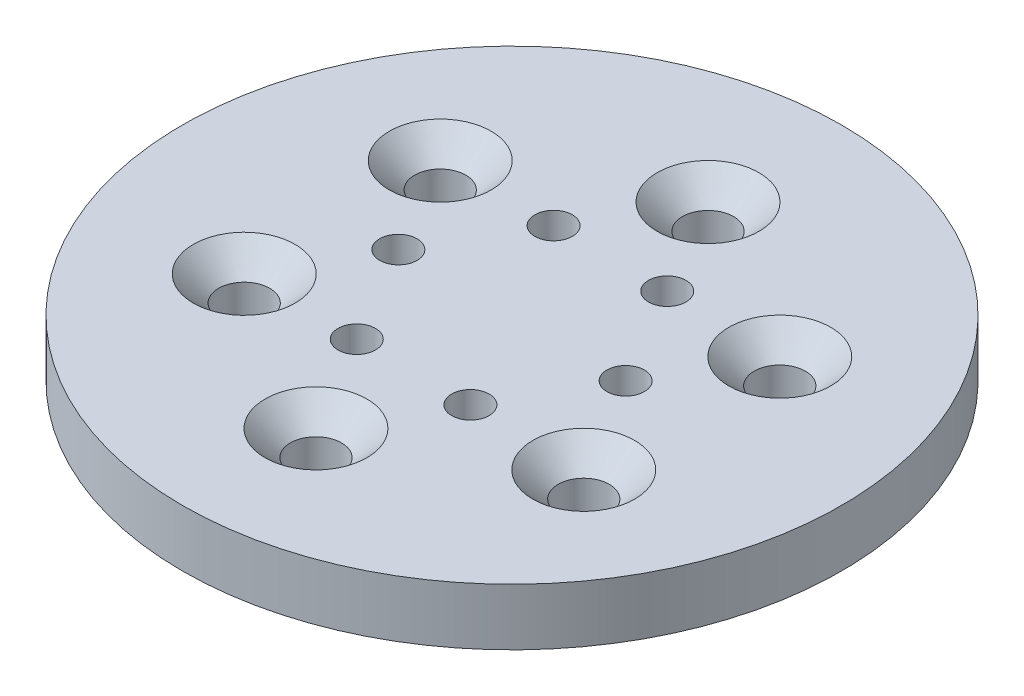
ISO-10303-21;
HEADER;
FILE_DESCRIPTION(('STEP AP214'),'2;1');
FILE_NAME('part.step','',(''),(''),'','','');
FILE_SCHEMA(('AUTOMOTIVE_DESIGN { 1 0 10303 214 1 1 1 1 }'));
ENDSEC;
DATA;
#1=APPLICATION_CONTEXT('core data for automotive mechanical design processes');
#2=APPLICATION_PROTOCOL_DEFINITION('international standard','automotive_design',2000,#1);
#3=PRODUCT_CONTEXT('',#1,'mechanical');
#4=PRODUCT('Part','Part','',(#3));
#5=PRODUCT_RELATED_PRODUCT_CATEGORY('part','',(#4));
#6=PRODUCT_DEFINITION_FORMATION('','',#4);
#7=PRODUCT_DEFINITION_CONTEXT('part definition',#1,'design');
#8=PRODUCT_DEFINITION('design','',#6,#7);
#9=PRODUCT_DEFINITION_SHAPE('','',#8);
#10=(LENGTH_UNIT() NAMED_UNIT(*) SI_UNIT(.MILLI.,.METRE.));
#11=(NAMED_UNIT(*) PLANE_ANGLE_UNIT() SI_UNIT($,.RADIAN.));
#12=(NAMED_UNIT(*) SI_UNIT($,.STERADIAN.) SOLID_ANGLE_UNIT());
#13=UNCERTAINTY_MEASURE_WITH_UNIT(LENGTH_MEASURE(1.E-05),#10,'distance_accuracy_value','');
#14=(GEOMETRIC_REPRESENTATION_CONTEXT(3) GLOBAL_UNCERTAINTY_ASSIGNED_CONTEXT((#13)) GLOBAL_UNIT_ASSIGNED_CONTEXT((#10,
#11,#12)) REPRESENTATION_CONTEXT('',''));
#15=CARTESIAN_POINT('',(0.,0.,0.));
#16=DIRECTION('',(0.,0.,1.));
#17=DIRECTION('',(1.,0.,0.));
#18=AXIS2_PLACEMENT_3D('',#15,#16,#17);
#19=CARTESIAN_POINT('',(0.,5.,0.));
#20=DIRECTION('',(0.,-1.,0.));
#21=DIRECTION('',(0.,0.,-1.));
#22=AXIS2_PLACEMENT_3D('',#19,#20,#21);
#23=CYLINDRICAL_SURFACE('',#22,29.);
#24=CARTESIAN_POINT('',(0.,5.,0.));
#25=DIRECTION('',(0.,1.,0.));
#26=DIRECTION('',(0.,0.,1.));
#27=AXIS2_PLACEMENT_3D('',#24,#25,#26);
#28=CIRCLE('',#27,29.);
#29=CARTESIAN_POINT('',(0.,5.,29.));
#30=VERTEX_POINT('',#29);
#31=EDGE_CURVE('E10',#30,#30,#28,.T.);
#32=ORIENTED_EDGE('',*,*,#31,.F.);
#33=EDGE_LOOP('',(#32));
#34=FACE_BOUND('',#33,.T.);
#35=CARTESIAN_POINT('',(0.,0.,0.));
#36=DIRECTION('',(0.,1.,0.));
#37=DIRECTION('',(0.,0.,1.));
#38=AXIS2_PLACEMENT_3D('',#35,#36,#37);
#39=CIRCLE('',#38,29.);
#40=CARTESIAN_POINT('',(0.,0.,29.));
#41=VERTEX_POINT('',#40);
#42=EDGE_CURVE('E50',#41,#41,#39,.T.);
#43=ORIENTED_EDGE('',*,*,#42,.T.);
#44=EDGE_LOOP('',(#43));
#45=FACE_BOUND('',#44,.T.);
#46=ADVANCED_FACE('F47',(#34,#45),#23,.T.);
#47=CARTESIAN_POINT('',(0.,5.,0.));
#48=DIRECTION('',(0.,1.,0.));
#49=DIRECTION('',(0.,0.,1.));
#50=AXIS2_PLACEMENT_3D('',#47,#48,#49);
#51=PLANE('',#50);
#52=CARTESIAN_POINT('',(-4.99999999999995,5.,-8.66025403784441));
#53=DIRECTION('',(0.,1.,0.));
#54=DIRECTION('',(0.,0.,1.));
#55=AXIS2_PLACEMENT_3D('',#52,#53,#54);
#56=CIRCLE('',#55,1.65);
#57=CARTESIAN_POINT('',(-4.99999999999995,5.,-7.01025403784441));
#58=VERTEX_POINT('',#57);
#59=EDGE_CURVE('E176',#58,#58,#56,.T.);
#60=ORIENTED_EDGE('',*,*,#59,.F.);
#61=EDGE_LOOP('',(#60));
#62=FACE_BOUND('',#61,.T.);
#63=CARTESIAN_POINT('',(5.00000000000006,5.,-8.66025403784492));
#64=DIRECTION('',(0.,1.,0.));
#65=DIRECTION('',(0.,0.,1.));
#66=AXIS2_PLACEMENT_3D('',#63,#64,#65);
#67=CIRCLE('',#66,1.65);
#68=CARTESIAN_POINT('',(5.00000000000006,5.,-7.01025403784492));
#69=VERTEX_POINT('',#68);
#70=EDGE_CURVE('E168',#69,#69,#67,.T.);
#71=ORIENTED_EDGE('',*,*,#70,.F.);
#72=EDGE_LOOP('',(#71));
#73=FACE_BOUND('',#72,.T.);
#74=CARTESIAN_POINT('',(10.0000000000005,5.,-7.86612467306541E-13));
#75=DIRECTION('',(0.,1.,0.));
#76=DIRECTION('',(0.,0.,1.));
#77=AXIS2_PLACEMENT_3D('',#74,#75,#76);
#78=CIRCLE('',#77,1.65);
#79=CARTESIAN_POINT('',(10.0000000000005,5.,1.64999999999921));
#80=VERTEX_POINT('',#79);
#81=EDGE_CURVE('E160',#80,#80,#78,.T.);
#82=ORIENTED_EDGE('',*,*,#81,.F.);
#83=EDGE_LOOP('',(#82));
#84=FACE_BOUND('',#83,.T.);
#85=CARTESIAN_POINT('',(5.00000000000093,5.,8.66025403784386));
#86=DIRECTION('',(0.,1.,0.));
#87=DIRECTION('',(0.,0.,1.));
#88=AXIS2_PLACEMENT_3D('',#85,#86,#87);
#89=CIRCLE('',#88,1.65);
#90=CARTESIAN_POINT('',(5.00000000000093,5.,10.3102540378439));
#91=VERTEX_POINT('',#90);
#92=EDGE_CURVE('E152',#91,#91,#89,.T.);
#93=ORIENTED_EDGE('',*,*,#92,.F.);
#94=EDGE_LOOP('',(#93));
#95=FACE_BOUND('',#94,.T.);
#96=CARTESIAN_POINT('',(-4.99999999999907,5.,8.66025403784437));
#97=DIRECTION('',(0.,1.,0.));
#98=DIRECTION('',(0.,0.,1.));
#99=AXIS2_PLACEMENT_3D('',#96,#97,#98);
#100=CIRCLE('',#99,1.65);
#101=CARTESIAN_POINT('',(-4.99999999999907,5.,10.3102540378444));
#102=VERTEX_POINT('',#101);
#103=EDGE_CURVE('E144',#102,#102,#100,.T.);
#104=ORIENTED_EDGE('',*,*,#103,.F.);
#105=EDGE_LOOP('',(#104));
#106=FACE_BOUND('',#105,.T.);
#107=CARTESIAN_POINT('',(-9.99999999999952,5.,2.2680718988484E-13));
#108=DIRECTION('',(0.,1.,0.));
#109=DIRECTION('',(0.,0.,1.));
#110=AXIS2_PLACEMENT_3D('',#107,#108,#109);
#111=CIRCLE('',#110,1.65);
#112=CARTESIAN_POINT('',(-9.99999999999952,5.,1.65000000000023));
#113=VERTEX_POINT('',#112);
#114=EDGE_CURVE('E136',#113,#113,#111,.T.);
#115=ORIENTED_EDGE('',*,*,#114,.F.);
#116=EDGE_LOOP('',(#115));
#117=FACE_BOUND('',#116,.T.);
#118=CARTESIAN_POINT('',(0.,5.,-17.25));
#119=DIRECTION('',(0.,1.,0.));
#120=DIRECTION('',(0.,0.,1.));
#121=AXIS2_PLACEMENT_3D('',#118,#119,#120);
#122=CIRCLE('',#121,4.48);
#123=CARTESIAN_POINT('',(0.,5.,-12.77));
#124=VERTEX_POINT('',#123);
#125=EDGE_CURVE('E128',#124,#124,#122,.T.);
#126=ORIENTED_EDGE('',*,*,#125,.F.);
#127=EDGE_LOOP('',(#126));
#128=FACE_BOUND('',#127,.T.);
#129=CARTESIAN_POINT('',(14.9389382152816,5.,-8.62499999999997));
#130=DIRECTION('',(0.,1.,0.));
#131=DIRECTION('',(0.,0.,1.));
#132=AXIS2_PLACEMENT_3D('',#129,#130,#131);
#133=CIRCLE('',#132,4.48);
#134=CARTESIAN_POINT('',(14.9389382152816,5.,-4.14499999999997));
#135=VERTEX_POINT('',#134);
#136=EDGE_CURVE('E116',#135,#135,#133,.T.);
#137=ORIENTED_EDGE('',*,*,#136,.F.);
#138=EDGE_LOOP('',(#137));
#139=FACE_BOUND('',#138,.T.);
#140=CARTESIAN_POINT('',(14.9389382152815,5.,8.62500000000007));
#141=DIRECTION('',(0.,1.,0.));
#142=DIRECTION('',(0.,0.,1.));
#143=AXIS2_PLACEMENT_3D('',#140,#141,#142);
#144=CIRCLE('',#143,4.48);
#145=CARTESIAN_POINT('',(14.9389382152815,5.,13.1050000000001));
#146=VERTEX_POINT('',#145);
#147=EDGE_CURVE('E104',#146,#146,#144,.T.);
#148=ORIENTED_EDGE('',*,*,#147,.F.);
#149=EDGE_LOOP('',(#148));
#150=FACE_BOUND('',#149,.T.);
#151=CARTESIAN_POINT('',(-1.20456106190088E-13,5.,17.25));
#152=DIRECTION('',(0.,1.,0.));
#153=DIRECTION('',(0.,0.,1.));
#154=AXIS2_PLACEMENT_3D('',#151,#152,#153);
#155=CIRCLE('',#154,4.48);
#156=CARTESIAN_POINT('',(-1.20456106190088E-13,5.,21.73));
#157=VERTEX_POINT('',#156);
#158=EDGE_CURVE('E92',#157,#157,#155,.T.);
#159=ORIENTED_EDGE('',*,*,#158,.F.);
#160=EDGE_LOOP('',(#159));
#161=FACE_BOUND('',#160,.T.);
#162=CARTESIAN_POINT('',(-14.9389382152816,5.,8.62499999999986));
#163=DIRECTION('',(0.,1.,0.));
#164=DIRECTION('',(0.,0.,1.));
#165=AXIS2_PLACEMENT_3D('',#162,#163,#164);
#166=CIRCLE('',#165,4.48);
#167=CARTESIAN_POINT('',(-14.9389382152816,5.,13.1049999999999));
#168=VERTEX_POINT('',#167);
#169=EDGE_CURVE('E80',#168,#168,#166,.T.);
#170=ORIENTED_EDGE('',*,*,#169,.F.);
#171=EDGE_LOOP('',(#170));
#172=FACE_BOUND('',#171,.T.);
#173=CARTESIAN_POINT('',(-14.9389382152815,5.,-8.62500000000018));
#174=DIRECTION('',(0.,1.,0.));
#175=DIRECTION('',(0.,0.,1.));
#176=AXIS2_PLACEMENT_3D('',#173,#174,#175);
#177=CIRCLE('',#176,4.48);
#178=CARTESIAN_POINT('',(-14.9389382152815,5.,-4.14500000000017));
#179=VERTEX_POINT('',#178);
#180=EDGE_CURVE('E68',#179,#179,#177,.T.);
#181=ORIENTED_EDGE('',*,*,#180,.F.);
#182=EDGE_LOOP('',(#181));
#183=FACE_BOUND('',#182,.T.);
#184=ORIENTED_EDGE('',*,*,#31,.T.);
#185=EDGE_LOOP('',(#184));
#186=FACE_BOUND('',#185,.T.);
#187=ADVANCED_FACE('F183',(#62,#73,#84,#95,#106,#117,#128,#139,#150,#161,#172,#183,#186),#51,.T.);
#188=CARTESIAN_POINT('',(0.,0.,0.));
#189=DIRECTION('',(0.,1.,0.));
#190=DIRECTION('',(0.,0.,1.));
#191=AXIS2_PLACEMENT_3D('',#188,#189,#190);
#192=PLANE('',#191);
#193=CARTESIAN_POINT('',(-4.99999999999995,0.,-8.66025403784441));
#194=DIRECTION('',(0.,1.,0.));
#195=DIRECTION('',(0.,0.,1.));
#196=AXIS2_PLACEMENT_3D('',#193,#194,#195);
#197=CIRCLE('',#196,1.65);
#198=CARTESIAN_POINT('',(-4.99999999999995,0.,-7.01025403784442));
#199=VERTEX_POINT('',#198);
#200=EDGE_CURVE('E172',#199,#199,#197,.T.);
#201=ORIENTED_EDGE('',*,*,#200,.T.);
#202=EDGE_LOOP('',(#201));
#203=FACE_BOUND('',#202,.T.);
#204=CARTESIAN_POINT('',(5.00000000000006,0.,-8.66025403784492));
#205=DIRECTION('',(0.,1.,0.));
#206=DIRECTION('',(0.,0.,1.));
#207=AXIS2_PLACEMENT_3D('',#204,#205,#206);
#208=CIRCLE('',#207,1.65);
#209=CARTESIAN_POINT('',(5.00000000000006,0.,-7.01025403784492));
#210=VERTEX_POINT('',#209);
#211=EDGE_CURVE('E164',#210,#210,#208,.T.);
#212=ORIENTED_EDGE('',*,*,#211,.T.);
#213=EDGE_LOOP('',(#212));
#214=FACE_BOUND('',#213,.T.);
#215=CARTESIAN_POINT('',(10.0000000000005,0.,-7.86612467306541E-13));
#216=DIRECTION('',(0.,1.,0.));
#217=DIRECTION('',(0.,0.,1.));
#218=AXIS2_PLACEMENT_3D('',#215,#216,#217);
#219=CIRCLE('',#218,1.65);
#220=CARTESIAN_POINT('',(10.0000000000005,0.,1.64999999999921));
#221=VERTEX_POINT('',#220);
#222=EDGE_CURVE('E156',#221,#221,#219,.T.);
#223=ORIENTED_EDGE('',*,*,#222,.T.);
#224=EDGE_LOOP('',(#223));
#225=FACE_BOUND('',#224,.T.);
#226=CARTESIAN_POINT('',(5.00000000000093,0.,8.66025403784386));
#227=DIRECTION('',(0.,1.,0.));
#228=DIRECTION('',(0.,0.,1.));
#229=AXIS2_PLACEMENT_3D('',#226,#227,#228);
#230=CIRCLE('',#229,1.65);
#231=CARTESIAN_POINT('',(5.00000000000093,0.,10.3102540378439));
#232=VERTEX_POINT('',#231);
#233=EDGE_CURVE('E148',#232,#232,#230,.T.);
#234=ORIENTED_EDGE('',*,*,#233,.T.);
#235=EDGE_LOOP('',(#234));
#236=FACE_BOUND('',#235,.T.);
#237=CARTESIAN_POINT('',(-4.99999999999907,0.,8.66025403784437));
#238=DIRECTION('',(0.,1.,0.));
#239=DIRECTION('',(0.,0.,1.));
#240=AXIS2_PLACEMENT_3D('',#237,#238,#239);
#241=CIRCLE('',#240,1.65);
#242=CARTESIAN_POINT('',(-4.99999999999907,0.,10.3102540378444));
#243=VERTEX_POINT('',#242);
#244=EDGE_CURVE('E140',#243,#243,#241,.T.);
#245=ORIENTED_EDGE('',*,*,#244,.T.);
#246=EDGE_LOOP('',(#245));
#247=FACE_BOUND('',#246,.T.);
#248=CARTESIAN_POINT('',(-9.99999999999952,0.,2.2680718988484E-13));
#249=DIRECTION('',(0.,1.,0.));
#250=DIRECTION('',(0.,0.,1.));
#251=AXIS2_PLACEMENT_3D('',#248,#249,#250);
#252=CIRCLE('',#251,1.65);
#253=CARTESIAN_POINT('',(-9.99999999999952,0.,1.65000000000023));
#254=VERTEX_POINT('',#253);
#255=EDGE_CURVE('E132',#254,#254,#252,.T.);
#256=ORIENTED_EDGE('',*,*,#255,.T.);
#257=EDGE_LOOP('',(#256));
#258=FACE_BOUND('',#257,.T.);
#259=CARTESIAN_POINT('',(0.,0.,-17.25));
#260=DIRECTION('',(0.,1.,0.));
#261=DIRECTION('',(0.,0.,1.));
#262=AXIS2_PLACEMENT_3D('',#259,#260,#261);
#263=CIRCLE('',#262,2.25);
#264=CARTESIAN_POINT('',(0.,0.,-15.));
#265=VERTEX_POINT('',#264);
#266=EDGE_CURVE('E120',#265,#265,#263,.T.);
#267=ORIENTED_EDGE('',*,*,#266,.T.);
#268=EDGE_LOOP('',(#267));
#269=FACE_BOUND('',#268,.T.);
#270=CARTESIAN_POINT('',(14.9389382152816,0.,-8.62499999999997));
#271=DIRECTION('',(0.,1.,0.));
#272=DIRECTION('',(0.,0.,1.));
#273=AXIS2_PLACEMENT_3D('',#270,#271,#272);
#274=CIRCLE('',#273,2.25);
#275=CARTESIAN_POINT('',(14.9389382152816,0.,-6.37499999999997));
#276=VERTEX_POINT('',#275);
#277=EDGE_CURVE('E108',#276,#276,#274,.T.);
#278=ORIENTED_EDGE('',*,*,#277,.T.);
#279=EDGE_LOOP('',(#278));
#280=FACE_BOUND('',#279,.T.);
#281=CARTESIAN_POINT('',(14.9389382152815,0.,8.62500000000007));
#282=DIRECTION('',(0.,1.,0.));
#283=DIRECTION('',(0.,0.,1.));
#284=AXIS2_PLACEMENT_3D('',#281,#282,#283);
#285=CIRCLE('',#284,2.25);
#286=CARTESIAN_POINT('',(14.9389382152815,0.,10.8750000000001));
#287=VERTEX_POINT('',#286);
#288=EDGE_CURVE('E96',#287,#287,#285,.T.);
#289=ORIENTED_EDGE('',*,*,#288,.T.);
#290=EDGE_LOOP('',(#289));
#291=FACE_BOUND('',#290,.T.);
#292=CARTESIAN_POINT('',(-1.20456106190088E-13,0.,17.25));
#293=DIRECTION('',(0.,1.,0.));
#294=DIRECTION('',(0.,0.,1.));
#295=AXIS2_PLACEMENT_3D('',#292,#293,#294);
#296=CIRCLE('',#295,2.25);
#297=CARTESIAN_POINT('',(-1.20456106190088E-13,0.,19.5));
#298=VERTEX_POINT('',#297);
#299=EDGE_CURVE('E84',#298,#298,#296,.T.);
#300=ORIENTED_EDGE('',*,*,#299,.T.);
#301=EDGE_LOOP('',(#300));
#302=FACE_BOUND('',#301,.T.);
#303=CARTESIAN_POINT('',(-14.9389382152816,0.,8.62499999999986));
#304=DIRECTION('',(0.,1.,0.));
#305=DIRECTION('',(0.,0.,1.));
#306=AXIS2_PLACEMENT_3D('',#303,#304,#305);
#307=CIRCLE('',#306,2.25);
#308=CARTESIAN_POINT('',(-14.9389382152816,0.,10.8749999999999));
#309=VERTEX_POINT('',#308);
#310=EDGE_CURVE('E72',#309,#309,#307,.T.);
#311=ORIENTED_EDGE('',*,*,#310,.T.);
#312=EDGE_LOOP('',(#311));
#313=FACE_BOUND('',#312,.T.);
#314=CARTESIAN_POINT('',(-14.9389382152815,0.,-8.62500000000018));
#315=DIRECTION('',(0.,1.,0.));
#316=DIRECTION('',(0.,0.,1.));
#317=AXIS2_PLACEMENT_3D('',#314,#315,#316);
#318=CIRCLE('',#317,2.25);
#319=CARTESIAN_POINT('',(-14.9389382152815,0.,-6.37500000000018));
#320=VERTEX_POINT('',#319);
#321=EDGE_CURVE('E59',#320,#320,#318,.T.);
#322=ORIENTED_EDGE('',*,*,#321,.T.);
#323=EDGE_LOOP('',(#322));
#324=FACE_BOUND('',#323,.T.);
#325=ORIENTED_EDGE('',*,*,#42,.F.);
#326=EDGE_LOOP('',(#325));
#327=FACE_BOUND('',#326,.T.);
#328=ADVANCED_FACE('F186',(#203,#214,#225,#236,#247,#258,#269,#280,#291,#302,#313,#324,#327),
#192,.F.);
#329=CARTESIAN_POINT('',(-14.9389382152815,5.,-8.62500000000018));
#330=DIRECTION('',(0.,1.,0.));
#331=DIRECTION('',(0.,0.,1.));
#332=AXIS2_PLACEMENT_3D('',#329,#330,#331);
#333=CYLINDRICAL_SURFACE('',#332,2.25);
#334=ORIENTED_EDGE('',*,*,#321,.F.);
#335=EDGE_LOOP('',(#334));
#336=FACE_BOUND('',#335,.T.);
#337=CARTESIAN_POINT('',(-14.9389382152815,2.77,-8.62500000000018));
#338=DIRECTION('',(0.,1.,0.));
#339=DIRECTION('',(0.,0.,1.));
#340=AXIS2_PLACEMENT_3D('',#337,#338,#339);
#341=CIRCLE('',#340,2.25);
#342=CARTESIAN_POINT('',(-14.9389382152815,2.77,-6.37500000000018));
#343=VERTEX_POINT('',#342);
#344=EDGE_CURVE('E64',#343,#343,#341,.T.);
#345=ORIENTED_EDGE('',*,*,#344,.T.);
#346=EDGE_LOOP('',(#345));
#347=FACE_BOUND('',#346,.T.);
#348=ADVANCED_FACE('F213',(#336,#347),#333,.F.);
#349=CARTESIAN_POINT('',(-14.9389382152815,5.,-8.62500000000018));
#350=DIRECTION('',(0.,1.,0.));
#351=DIRECTION('',(0.,0.,1.));
#352=AXIS2_PLACEMENT_3D('',#349,#350,#351);
#353=CONICAL_SURFACE('',#352,4.48,0.785398163397448);
#354=ORIENTED_EDGE('',*,*,#344,.F.);
#355=EDGE_LOOP('',(#354));
#356=FACE_BOUND('',#355,.T.);
#357=ORIENTED_EDGE('',*,*,#180,.T.);
#358=EDGE_LOOP('',(#357));
#359=FACE_BOUND('',#358,.T.);
#360=ADVANCED_FACE('F210',(#356,#359),#353,.F.);
#361=CARTESIAN_POINT('',(-14.9389382152816,5.,8.62499999999986));
#362=DIRECTION('',(0.,1.,0.));
#363=DIRECTION('',(0.,0.,1.));
#364=AXIS2_PLACEMENT_3D('',#361,#362,#363);
#365=CYLINDRICAL_SURFACE('',#364,2.25);
#366=ORIENTED_EDGE('',*,*,#310,.F.);
#367=EDGE_LOOP('',(#366));
#368=FACE_BOUND('',#367,.T.);
#369=CARTESIAN_POINT('',(-14.9389382152816,2.77,8.62499999999986));
#370=DIRECTION('',(0.,1.,0.));
#371=DIRECTION('',(0.,0.,1.));
#372=AXIS2_PLACEMENT_3D('',#369,#370,#371);
#373=CIRCLE('',#372,2.25);
#374=CARTESIAN_POINT('',(-14.9389382152816,2.77,10.8749999999999));
#375=VERTEX_POINT('',#374);
#376=EDGE_CURVE('E76',#375,#375,#373,.T.);
#377=ORIENTED_EDGE('',*,*,#376,.T.);
#378=EDGE_LOOP('',(#377));
#379=FACE_BOUND('',#378,.T.);
#380=ADVANCED_FACE('F212',(#368,#379),#365,.F.);
#381=CARTESIAN_POINT('',(-14.9389382152816,5.,8.62499999999986));
#382=DIRECTION('',(0.,1.,0.));
#383=DIRECTION('',(0.,0.,1.));
#384=AXIS2_PLACEMENT_3D('',#381,#382,#383);
#385=CONICAL_SURFACE('',#384,4.48,0.785398163397448);
#386=ORIENTED_EDGE('',*,*,#376,.F.);
#387=EDGE_LOOP('',(#386));
#388=FACE_BOUND('',#387,.T.);
#389=ORIENTED_EDGE('',*,*,#169,.T.);
#390=EDGE_LOOP('',(#389));
#391=FACE_BOUND('',#390,.T.);
#392=ADVANCED_FACE('F220',(#388,#391),#385,.F.);
#393=CARTESIAN_POINT('',(-1.20456106190088E-13,5.,17.25));
#394=DIRECTION('',(0.,1.,0.));
#395=DIRECTION('',(0.,0.,1.));
#396=AXIS2_PLACEMENT_3D('',#393,#394,#395);
#397=CYLINDRICAL_SURFACE('',#396,2.25);
#398=ORIENTED_EDGE('',*,*,#299,.F.);
#399=EDGE_LOOP('',(#398));
#400=FACE_BOUND('',#399,.T.);
#401=CARTESIAN_POINT('',(-1.20456106190088E-13,2.77,17.25));
#402=DIRECTION('',(0.,1.,0.));
#403=DIRECTION('',(0.,0.,1.));
#404=AXIS2_PLACEMENT_3D('',#401,#402,#403);
#405=CIRCLE('',#404,2.25);
#406=CARTESIAN_POINT('',(-1.20456106190088E-13,2.77,19.5));
#407=VERTEX_POINT('',#406);
#408=EDGE_CURVE('E88',#407,#407,#405,.T.);
#409=ORIENTED_EDGE('',*,*,#408,.T.);
#410=EDGE_LOOP('',(#409));
#411=FACE_BOUND('',#410,.T.);
#412=ADVANCED_FACE('F267',(#400,#411),#397,.F.);
#413=CARTESIAN_POINT('',(-1.20456106190088E-13,5.,17.25));
#414=DIRECTION('',(0.,1.,0.));
#415=DIRECTION('',(0.,0.,1.));
#416=AXIS2_PLACEMENT_3D('',#413,#414,#415);
#417=CONICAL_SURFACE('',#416,4.48,0.785398163397448);
#418=ORIENTED_EDGE('',*,*,#408,.F.);
#419=EDGE_LOOP('',(#418));
#420=FACE_BOUND('',#419,.T.);
#421=ORIENTED_EDGE('',*,*,#158,.T.);
#422=EDGE_LOOP('',(#421));
#423=FACE_BOUND('',#422,.T.);
#424=ADVANCED_FACE('F272',(#420,#423),#417,.F.);
#425=CARTESIAN_POINT('',(14.9389382152815,5.,8.62500000000007));
#426=DIRECTION('',(0.,1.,0.));
#427=DIRECTION('',(0.,0.,1.));
#428=AXIS2_PLACEMENT_3D('',#425,#426,#427);
#429=CYLINDRICAL_SURFACE('',#428,2.25);
#430=ORIENTED_EDGE('',*,*,#288,.F.);
#431=EDGE_LOOP('',(#430));
#432=FACE_BOUND('',#431,.T.);
#433=CARTESIAN_POINT('',(14.9389382152815,2.77,8.62500000000007));
#434=DIRECTION('',(0.,1.,0.));
#435=DIRECTION('',(0.,0.,1.));
#436=AXIS2_PLACEMENT_3D('',#433,#434,#435);
#437=CIRCLE('',#436,2.25);
#438=CARTESIAN_POINT('',(14.9389382152815,2.77,10.8750000000001));
#439=VERTEX_POINT('',#438);
#440=EDGE_CURVE('E100',#439,#439,#437,.T.);
#441=ORIENTED_EDGE('',*,*,#440,.T.);
#442=EDGE_LOOP('',(#441));
#443=FACE_BOUND('',#442,.T.);
#444=ADVANCED_FACE('F278',(#432,#443),#429,.F.);
#445=CARTESIAN_POINT('',(14.9389382152815,5.,8.62500000000007));
#446=DIRECTION('',(0.,1.,0.));
#447=DIRECTION('',(0.,0.,1.));
#448=AXIS2_PLACEMENT_3D('',#445,#446,#447);
#449=CONICAL_SURFACE('',#448,4.48,0.785398163397448);
#450=ORIENTED_EDGE('',*,*,#440,.F.);
#451=EDGE_LOOP('',(#450));
#452=FACE_BOUND('',#451,.T.);
#453=ORIENTED_EDGE('',*,*,#147,.T.);
#454=EDGE_LOOP('',(#453));
#455=FACE_BOUND('',#454,.T.);
#456=ADVANCED_FACE('F282',(#452,#455),#449,.F.);
#457=CARTESIAN_POINT('',(14.9389382152816,5.,-8.62499999999997));
#458=DIRECTION('',(0.,1.,0.));
#459=DIRECTION('',(0.,0.,1.));
#460=AXIS2_PLACEMENT_3D('',#457,#458,#459);
#461=CYLINDRICAL_SURFACE('',#460,2.25);
#462=ORIENTED_EDGE('',*,*,#277,.F.);
#463=EDGE_LOOP('',(#462));
#464=FACE_BOUND('',#463,.T.);
#465=CARTESIAN_POINT('',(14.9389382152816,2.77,-8.62499999999997));
#466=DIRECTION('',(0.,1.,0.));
#467=DIRECTION('',(0.,0.,1.));
#468=AXIS2_PLACEMENT_3D('',#465,#466,#467);
#469=CIRCLE('',#468,2.25);
#470=CARTESIAN_POINT('',(14.9389382152816,2.77,-6.37499999999997));
#471=VERTEX_POINT('',#470);
#472=EDGE_CURVE('E112',#471,#471,#469,.T.);
#473=ORIENTED_EDGE('',*,*,#472,.T.);
#474=EDGE_LOOP('',(#473));
#475=FACE_BOUND('',#474,.T.);
#476=ADVANCED_FACE('F286',(#464,#475),#461,.F.);
#477=CARTESIAN_POINT('',(14.9389382152816,5.,-8.62499999999997));
#478=DIRECTION('',(0.,1.,0.));
#479=DIRECTION('',(0.,0.,1.));
#480=AXIS2_PLACEMENT_3D('',#477,#478,#479);
#481=CONICAL_SURFACE('',#480,4.48,0.785398163397448);
#482=ORIENTED_EDGE('',*,*,#472,.F.);
#483=EDGE_LOOP('',(#482));
#484=FACE_BOUND('',#483,.T.);
#485=ORIENTED_EDGE('',*,*,#136,.T.);
#486=EDGE_LOOP('',(#485));
#487=FACE_BOUND('',#486,.T.);
#488=ADVANCED_FACE('F290',(#484,#487),#481,.F.);
#489=CARTESIAN_POINT('',(0.,5.,-17.25));
#490=DIRECTION('',(0.,1.,0.));
#491=DIRECTION('',(0.,0.,1.));
#492=AXIS2_PLACEMENT_3D('',#489,#490,#491);
#493=CYLINDRICAL_SURFACE('',#492,2.25);
#494=ORIENTED_EDGE('',*,*,#266,.F.);
#495=EDGE_LOOP('',(#494));
#496=FACE_BOUND('',#495,.T.);
#497=CARTESIAN_POINT('',(0.,2.77,-17.25));
#498=DIRECTION('',(0.,1.,0.));
#499=DIRECTION('',(0.,0.,1.));
#500=AXIS2_PLACEMENT_3D('',#497,#498,#499);
#501=CIRCLE('',#500,2.25);
#502=CARTESIAN_POINT('',(0.,2.77,-15.));
#503=VERTEX_POINT('',#502);
#504=EDGE_CURVE('E124',#503,#503,#501,.T.);
#505=ORIENTED_EDGE('',*,*,#504,.T.);
#506=EDGE_LOOP('',(#505));
#507=FACE_BOUND('',#506,.T.);
#508=ADVANCED_FACE('F294',(#496,#507),#493,.F.);
#509=CARTESIAN_POINT('',(0.,5.,-17.25));
#510=DIRECTION('',(0.,1.,0.));
#511=DIRECTION('',(0.,0.,1.));
#512=AXIS2_PLACEMENT_3D('',#509,#510,#511);
#513=CONICAL_SURFACE('',#512,4.48,0.785398163397448);
#514=ORIENTED_EDGE('',*,*,#504,.F.);
#515=EDGE_LOOP('',(#514));
#516=FACE_BOUND('',#515,.T.);
#517=ORIENTED_EDGE('',*,*,#125,.T.);
#518=EDGE_LOOP('',(#517));
#519=FACE_BOUND('',#518,.T.);
#520=ADVANCED_FACE('F298',(#516,#519),#513,.F.);
#521=CARTESIAN_POINT('',(-9.99999999999952,5.,2.2680718988484E-13));
#522=DIRECTION('',(0.,1.,0.));
#523=DIRECTION('',(0.,0.,1.));
#524=AXIS2_PLACEMENT_3D('',#521,#522,#523);
#525=CYLINDRICAL_SURFACE('',#524,1.65);
#526=ORIENTED_EDGE('',*,*,#255,.F.);
#527=EDGE_LOOP('',(#526));
#528=FACE_BOUND('',#527,.T.);
#529=ORIENTED_EDGE('',*,*,#114,.T.);
#530=EDGE_LOOP('',(#529));
#531=FACE_BOUND('',#530,.T.);
#532=ADVANCED_FACE('F302',(#528,#531),#525,.F.);
#533=CARTESIAN_POINT('',(-4.99999999999907,5.,8.66025403784437));
#534=DIRECTION('',(0.,1.,0.));
#535=DIRECTION('',(0.,0.,1.));
#536=AXIS2_PLACEMENT_3D('',#533,#534,#535);
#537=CYLINDRICAL_SURFACE('',#536,1.65);
#538=ORIENTED_EDGE('',*,*,#244,.F.);
#539=EDGE_LOOP('',(#538));
#540=FACE_BOUND('',#539,.T.);
#541=ORIENTED_EDGE('',*,*,#103,.T.);
#542=EDGE_LOOP('',(#541));
#543=FACE_BOUND('',#542,.T.);
#544=ADVANCED_FACE('F306',(#540,#543),#537,.F.);
#545=CARTESIAN_POINT('',(5.00000000000093,5.,8.66025403784386));
#546=DIRECTION('',(0.,1.,0.));
#547=DIRECTION('',(0.,0.,1.));
#548=AXIS2_PLACEMENT_3D('',#545,#546,#547);
#549=CYLINDRICAL_SURFACE('',#548,1.65);
#550=ORIENTED_EDGE('',*,*,#233,.F.);
#551=EDGE_LOOP('',(#550));
#552=FACE_BOUND('',#551,.T.);
#553=ORIENTED_EDGE('',*,*,#92,.T.);
#554=EDGE_LOOP('',(#553));
#555=FACE_BOUND('',#554,.T.);
#556=ADVANCED_FACE('F310',(#552,#555),#549,.F.);
#557=CARTESIAN_POINT('',(10.0000000000005,5.,-7.86612467306541E-13));
#558=DIRECTION('',(0.,1.,0.));
#559=DIRECTION('',(0.,0.,1.));
#560=AXIS2_PLACEMENT_3D('',#557,#558,#559);
#561=CYLINDRICAL_SURFACE('',#560,1.65);
#562=ORIENTED_EDGE('',*,*,#222,.F.);
#563=EDGE_LOOP('',(#562));
#564=FACE_BOUND('',#563,.T.);
#565=ORIENTED_EDGE('',*,*,#81,.T.);
#566=EDGE_LOOP('',(#565));
#567=FACE_BOUND('',#566,.T.);
#568=ADVANCED_FACE('F314',(#564,#567),#561,.F.);
#569=CARTESIAN_POINT('',(5.00000000000006,5.,-8.66025403784492));
#570=DIRECTION('',(0.,1.,0.));
#571=DIRECTION('',(0.,0.,1.));
#572=AXIS2_PLACEMENT_3D('',#569,#570,#571);
#573=CYLINDRICAL_SURFACE('',#572,1.65);
#574=ORIENTED_EDGE('',*,*,#211,.F.);
#575=EDGE_LOOP('',(#574));
#576=FACE_BOUND('',#575,.T.);
#577=ORIENTED_EDGE('',*,*,#70,.T.);
#578=EDGE_LOOP('',(#577));
#579=FACE_BOUND('',#578,.T.);
#580=ADVANCED_FACE('F318',(#576,#579),#573,.F.);
#581=CARTESIAN_POINT('',(-4.99999999999995,5.,-8.66025403784441));
#582=DIRECTION('',(0.,1.,0.));
#583=DIRECTION('',(0.,0.,1.));
#584=AXIS2_PLACEMENT_3D('',#581,#582,#583);
#585=CYLINDRICAL_SURFACE('',#584,1.65);
#586=ORIENTED_EDGE('',*,*,#200,.F.);
#587=EDGE_LOOP('',(#586));
#588=FACE_BOUND('',#587,.T.);
#589=ORIENTED_EDGE('',*,*,#59,.T.);
#590=EDGE_LOOP('',(#589));
#591=FACE_BOUND('',#590,.T.);
#592=ADVANCED_FACE('F181',(#588,#591),#585,.F.);
#593=CLOSED_SHELL('',(#46,#187,#328,#348,#360,#380,#392,#412,#424,#444,#456,#476,#488,#508,#520,
#532,#544,#556,#568,#580,#592));
#594=MANIFOLD_SOLID_BREP('B2',#593);
#595=ADVANCED_BREP_SHAPE_REPRESENTATION('',(#18,#594),#14);
#596=SHAPE_DEFINITION_REPRESENTATION(#9,#595);
ENDSEC;
END-ISO-10303-21;
